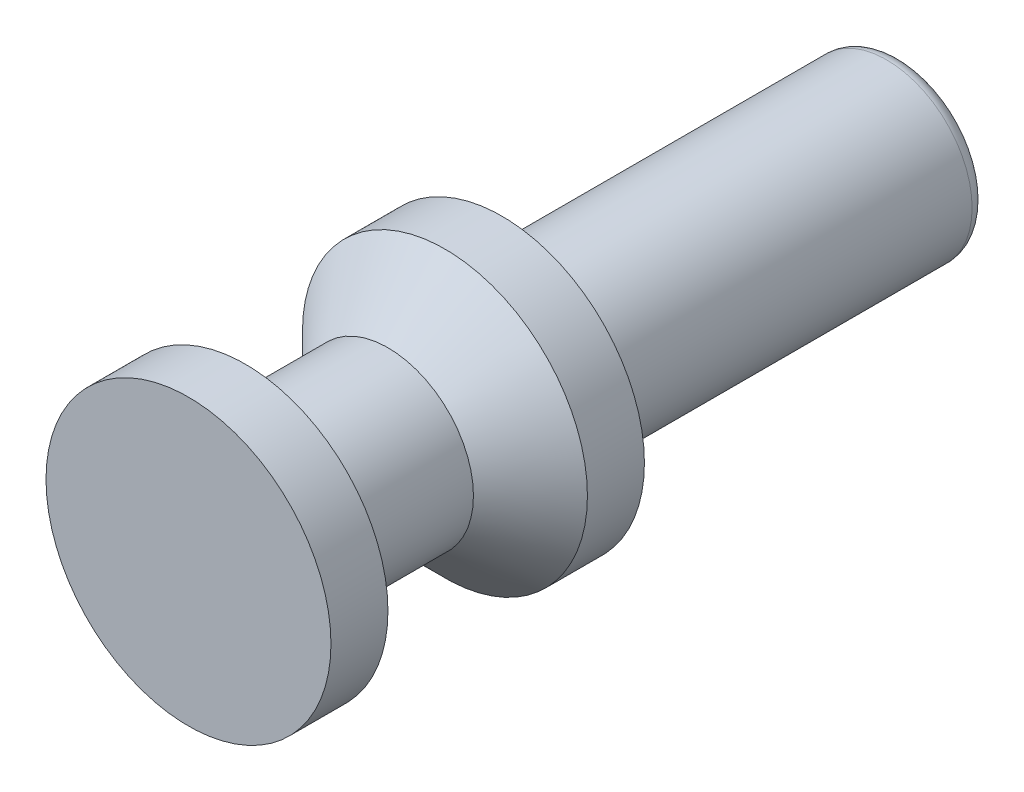
ISO-10303-21;
HEADER;
FILE_DESCRIPTION(('STEP AP214'),'2;1');
FILE_NAME('part.step','',(''),(''),'','','');
FILE_SCHEMA(('AUTOMOTIVE_DESIGN { 1 0 10303 214 1 1 1 1 }'));
ENDSEC;
DATA;
#1=APPLICATION_CONTEXT('core data for automotive mechanical design processes');
#2=APPLICATION_PROTOCOL_DEFINITION('international standard','automotive_design',2000,#1);
#3=PRODUCT_CONTEXT('',#1,'mechanical');
#4=PRODUCT('Part','Part','',(#3));
#5=PRODUCT_RELATED_PRODUCT_CATEGORY('part','',(#4));
#6=PRODUCT_DEFINITION_FORMATION('','',#4);
#7=PRODUCT_DEFINITION_CONTEXT('part definition',#1,'design');
#8=PRODUCT_DEFINITION('design','',#6,#7);
#9=PRODUCT_DEFINITION_SHAPE('','',#8);
#10=(LENGTH_UNIT() NAMED_UNIT(*) SI_UNIT(.MILLI.,.METRE.));
#11=(NAMED_UNIT(*) PLANE_ANGLE_UNIT() SI_UNIT($,.RADIAN.));
#12=(NAMED_UNIT(*) SI_UNIT($,.STERADIAN.) SOLID_ANGLE_UNIT());
#13=UNCERTAINTY_MEASURE_WITH_UNIT(LENGTH_MEASURE(1.E-05),#10,'distance_accuracy_value','');
#14=(GEOMETRIC_REPRESENTATION_CONTEXT(3) GLOBAL_UNCERTAINTY_ASSIGNED_CONTEXT((#13)) GLOBAL_UNIT_ASSIGNED_CONTEXT((#10,
#11,#12)) REPRESENTATION_CONTEXT('',''));
#15=CARTESIAN_POINT('',(0.,0.,0.));
#16=DIRECTION('',(0.,0.,1.));
#17=DIRECTION('',(1.,0.,0.));
#18=AXIS2_PLACEMENT_3D('',#15,#16,#17);
#19=CARTESIAN_POINT('',(0.,0.,12.5));
#20=DIRECTION('',(0.,0.,-1.));
#21=DIRECTION('',(-1.,0.,0.));
#22=AXIS2_PLACEMENT_3D('',#19,#20,#21);
#23=CYLINDRICAL_SURFACE('',#22,1.5);
#24=CARTESIAN_POINT('',(0.,0.,9.00000000000001));
#25=DIRECTION('',(0.,0.,1.));
#26=DIRECTION('',(1.,0.,0.));
#27=AXIS2_PLACEMENT_3D('',#24,#25,#26);
#28=CIRCLE('',#27,1.5);
#29=CARTESIAN_POINT('',(1.5,0.,9.00000000000001));
#30=VERTEX_POINT('',#29);
#31=EDGE_CURVE('E12',#30,#30,#28,.T.);
#32=ORIENTED_EDGE('',*,*,#31,.T.);
#33=EDGE_LOOP('',(#32));
#34=FACE_BOUND('',#33,.T.);
#35=CARTESIAN_POINT('',(0.,0.,11.5));
#36=DIRECTION('',(0.,0.,1.));
#37=DIRECTION('',(1.,0.,0.));
#38=AXIS2_PLACEMENT_3D('',#35,#36,#37);
#39=CIRCLE('',#38,1.5);
#40=CARTESIAN_POINT('',(1.5,0.,11.5));
#41=VERTEX_POINT('',#40);
#42=EDGE_CURVE('E76',#41,#41,#39,.T.);
#43=ORIENTED_EDGE('',*,*,#42,.F.);
#44=EDGE_LOOP('',(#43));
#45=FACE_BOUND('',#44,.T.);
#46=ADVANCED_FACE('F51',(#34,#45),#23,.T.);
#47=CARTESIAN_POINT('',(0.,0.,11.5));
#48=DIRECTION('',(0.,0.,1.));
#49=DIRECTION('',(1.,0.,0.));
#50=AXIS2_PLACEMENT_3D('',#47,#48,#49);
#51=CYLINDRICAL_SURFACE('',#50,2.5);
#52=CARTESIAN_POINT('',(0.,0.,11.5));
#53=DIRECTION('',(0.,0.,1.));
#54=DIRECTION('',(1.,0.,0.));
#55=AXIS2_PLACEMENT_3D('',#52,#53,#54);
#56=CIRCLE('',#55,2.5);
#57=CARTESIAN_POINT('',(2.5,0.,11.5));
#58=VERTEX_POINT('',#57);
#59=EDGE_CURVE('E80',#58,#58,#56,.T.);
#60=ORIENTED_EDGE('',*,*,#59,.T.);
#61=EDGE_LOOP('',(#60));
#62=FACE_BOUND('',#61,.T.);
#63=CARTESIAN_POINT('',(0.,0.,12.5));
#64=DIRECTION('',(0.,0.,1.));
#65=DIRECTION('',(1.,0.,0.));
#66=AXIS2_PLACEMENT_3D('',#63,#64,#65);
#67=CIRCLE('',#66,2.5);
#68=CARTESIAN_POINT('',(2.5,0.,12.5));
#69=VERTEX_POINT('',#68);
#70=EDGE_CURVE('E81',#69,#69,#67,.T.);
#71=ORIENTED_EDGE('',*,*,#70,.F.);
#72=EDGE_LOOP('',(#71));
#73=FACE_BOUND('',#72,.T.);
#74=ADVANCED_FACE('F114',(#62,#73),#51,.T.);
#75=CARTESIAN_POINT('',(0.,0.,11.5));
#76=DIRECTION('',(0.,0.,1.));
#77=DIRECTION('',(1.,0.,0.));
#78=AXIS2_PLACEMENT_3D('',#75,#76,#77);
#79=PLANE('',#78);
#80=ORIENTED_EDGE('',*,*,#42,.T.);
#81=EDGE_LOOP('',(#80));
#82=FACE_BOUND('',#81,.T.);
#83=ORIENTED_EDGE('',*,*,#59,.F.);
#84=EDGE_LOOP('',(#83));
#85=FACE_BOUND('',#84,.T.);
#86=ADVANCED_FACE('F120',(#82,#85),#79,.F.);
#87=CARTESIAN_POINT('',(0.,0.,12.5));
#88=DIRECTION('',(0.,0.,1.));
#89=DIRECTION('',(1.,0.,0.));
#90=AXIS2_PLACEMENT_3D('',#87,#88,#89);
#91=PLANE('',#90);
#92=ORIENTED_EDGE('',*,*,#70,.T.);
#93=EDGE_LOOP('',(#92));
#94=FACE_BOUND('',#93,.T.);
#95=ADVANCED_FACE('F111',(#94),#91,.T.);
#96=CARTESIAN_POINT('',(0.,0.,7.));
#97=DIRECTION('',(0.,0.,1.));
#98=DIRECTION('',(1.,0.,0.));
#99=AXIS2_PLACEMENT_3D('',#96,#97,#98);
#100=CYLINDRICAL_SURFACE('',#99,2.5);
#101=CARTESIAN_POINT('',(0.,0.,7.));
#102=DIRECTION('',(0.,0.,1.));
#103=DIRECTION('',(1.,0.,0.));
#104=AXIS2_PLACEMENT_3D('',#101,#102,#103);
#105=CIRCLE('',#104,2.5);
#106=CARTESIAN_POINT('',(2.5,0.,7.));
#107=VERTEX_POINT('',#106);
#108=EDGE_CURVE('E85',#107,#107,#105,.T.);
#109=ORIENTED_EDGE('',*,*,#108,.T.);
#110=EDGE_LOOP('',(#109));
#111=FACE_BOUND('',#110,.T.);
#112=CARTESIAN_POINT('',(0.,0.,8.));
#113=DIRECTION('',(0.,0.,1.));
#114=DIRECTION('',(1.,0.,0.));
#115=AXIS2_PLACEMENT_3D('',#112,#113,#114);
#116=CIRCLE('',#115,2.5);
#117=CARTESIAN_POINT('',(2.5,0.,8.));
#118=VERTEX_POINT('',#117);
#119=EDGE_CURVE('E89',#118,#118,#116,.T.);
#120=ORIENTED_EDGE('',*,*,#119,.F.);
#121=EDGE_LOOP('',(#120));
#122=FACE_BOUND('',#121,.T.);
#123=ADVANCED_FACE('F97',(#111,#122),#100,.T.);
#124=CARTESIAN_POINT('',(0.,0.,7.));
#125=DIRECTION('',(0.,0.,1.));
#126=DIRECTION('',(1.,0.,0.));
#127=AXIS2_PLACEMENT_3D('',#124,#125,#126);
#128=PLANE('',#127);
#129=CARTESIAN_POINT('',(0.,0.,7.));
#130=DIRECTION('',(0.,0.,1.));
#131=DIRECTION('',(1.,0.,0.));
#132=AXIS2_PLACEMENT_3D('',#129,#130,#131);
#133=CIRCLE('',#132,1.5);
#134=CARTESIAN_POINT('',(1.5,0.,7.));
#135=VERTEX_POINT('',#134);
#136=EDGE_CURVE('E60',#135,#135,#133,.T.);
#137=ORIENTED_EDGE('',*,*,#136,.T.);
#138=EDGE_LOOP('',(#137));
#139=FACE_BOUND('',#138,.T.);
#140=ORIENTED_EDGE('',*,*,#108,.F.);
#141=EDGE_LOOP('',(#140));
#142=FACE_BOUND('',#141,.T.);
#143=ADVANCED_FACE('F100',(#139,#142),#128,.F.);
#144=CARTESIAN_POINT('',(0.,0.,0.));
#145=DIRECTION('',(0.,0.,1.));
#146=DIRECTION('',(1.,0.,0.));
#147=AXIS2_PLACEMENT_3D('',#144,#145,#146);
#148=PLANE('',#147);
#149=CARTESIAN_POINT('',(0.,0.,0.));
#150=DIRECTION('',(0.,0.,1.));
#151=DIRECTION('',(1.,0.,0.));
#152=AXIS2_PLACEMENT_3D('',#149,#150,#151);
#153=CIRCLE('',#152,1.25);
#154=CARTESIAN_POINT('',(1.25,0.,0.));
#155=VERTEX_POINT('',#154);
#156=EDGE_CURVE('E65',#155,#155,#153,.F.);
#157=ORIENTED_EDGE('',*,*,#156,.T.);
#158=EDGE_LOOP('',(#157));
#159=FACE_BOUND('',#158,.T.);
#160=ADVANCED_FACE('F102',(#159),#148,.F.);
#161=CARTESIAN_POINT('',(0.,0.,0.25));
#162=DIRECTION('',(0.,0.,1.));
#163=DIRECTION('',(1.,0.,0.));
#164=AXIS2_PLACEMENT_3D('',#161,#162,#163);
#165=TOROIDAL_SURFACE('',#164,1.25,0.25);
#166=ORIENTED_EDGE('',*,*,#156,.F.);
#167=EDGE_LOOP('',(#166));
#168=FACE_BOUND('',#167,.T.);
#169=CARTESIAN_POINT('',(0.,0.,0.25));
#170=DIRECTION('',(0.,0.,1.));
#171=DIRECTION('',(1.,0.,0.));
#172=AXIS2_PLACEMENT_3D('',#169,#170,#171);
#173=CIRCLE('',#172,1.5);
#174=CARTESIAN_POINT('',(1.5,0.,0.25));
#175=VERTEX_POINT('',#174);
#176=EDGE_CURVE('E70',#175,#175,#173,.T.);
#177=ORIENTED_EDGE('',*,*,#176,.F.);
#178=EDGE_LOOP('',(#177));
#179=FACE_BOUND('',#178,.T.);
#180=ADVANCED_FACE('F108',(#168,#179),#165,.T.);
#181=ORIENTED_EDGE('',*,*,#176,.T.);
#182=EDGE_LOOP('',(#181));
#183=FACE_BOUND('',#182,.T.);
#184=ORIENTED_EDGE('',*,*,#136,.F.);
#185=EDGE_LOOP('',(#184));
#186=FACE_BOUND('',#185,.T.);
#187=ADVANCED_FACE('F116',(#183,#186),#23,.T.);
#188=CARTESIAN_POINT('',(0.,0.,9.00000000000001));
#189=DIRECTION('',(0.,0.,-1.));
#190=DIRECTION('',(-1.,0.,0.));
#191=AXIS2_PLACEMENT_3D('',#188,#189,#190);
#192=CONICAL_SURFACE('',#191,1.5,0.785398163397444);
#193=ORIENTED_EDGE('',*,*,#119,.T.);
#194=EDGE_LOOP('',(#193));
#195=FACE_BOUND('',#194,.T.);
#196=ORIENTED_EDGE('',*,*,#31,.F.);
#197=EDGE_LOOP('',(#196));
#198=FACE_BOUND('',#197,.T.);
#199=ADVANCED_FACE('F54',(#195,#198),#192,.T.);
#200=CLOSED_SHELL('',(#46,#74,#86,#95,#123,#143,#160,#180,#187,#199));
#201=MANIFOLD_SOLID_BREP('B2',#200);
#202=ADVANCED_BREP_SHAPE_REPRESENTATION('',(#18,#201),#14);
#203=SHAPE_DEFINITION_REPRESENTATION(#9,#202);
ENDSEC;
END-ISO-10303-21;
